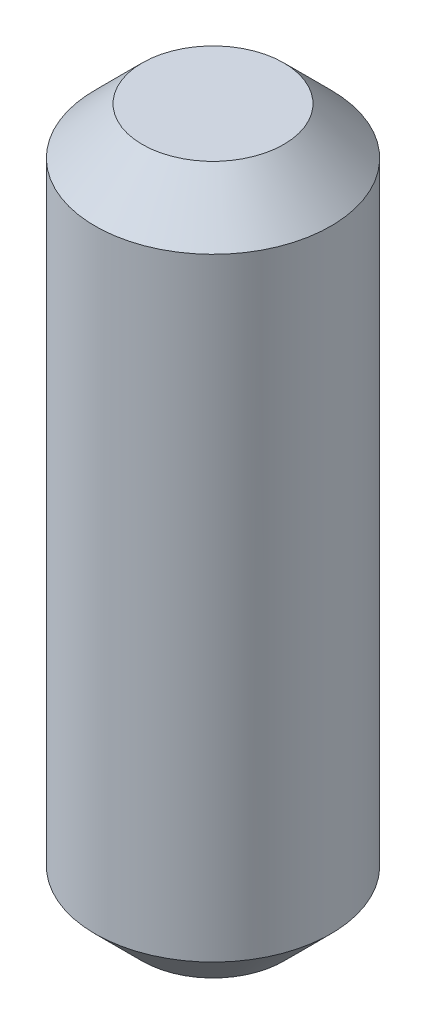
ISO-10303-21;
HEADER;
FILE_DESCRIPTION(('STEP AP214'),'2;1');
FILE_NAME('part.step','',(''),(''),'','','');
FILE_SCHEMA(('AUTOMOTIVE_DESIGN { 1 0 10303 214 1 1 1 1 }'));
ENDSEC;
DATA;
#1=APPLICATION_CONTEXT('core data for automotive mechanical design processes');
#2=APPLICATION_PROTOCOL_DEFINITION('international standard','automotive_design',2000,#1);
#3=PRODUCT_CONTEXT('',#1,'mechanical');
#4=PRODUCT('Part','Part','',(#3));
#5=PRODUCT_RELATED_PRODUCT_CATEGORY('part','',(#4));
#6=PRODUCT_DEFINITION_FORMATION('','',#4);
#7=PRODUCT_DEFINITION_CONTEXT('part definition',#1,'design');
#8=PRODUCT_DEFINITION('design','',#6,#7);
#9=PRODUCT_DEFINITION_SHAPE('','',#8);
#10=(LENGTH_UNIT() NAMED_UNIT(*) SI_UNIT(.MILLI.,.METRE.));
#11=(NAMED_UNIT(*) PLANE_ANGLE_UNIT() SI_UNIT($,.RADIAN.));
#12=(NAMED_UNIT(*) SI_UNIT($,.STERADIAN.) SOLID_ANGLE_UNIT());
#13=UNCERTAINTY_MEASURE_WITH_UNIT(LENGTH_MEASURE(1.E-05),#10,'distance_accuracy_value','');
#14=(GEOMETRIC_REPRESENTATION_CONTEXT(3) GLOBAL_UNCERTAINTY_ASSIGNED_CONTEXT((#13)) GLOBAL_UNIT_ASSIGNED_CONTEXT((#10,
#11,#12)) REPRESENTATION_CONTEXT('',''));
#15=CARTESIAN_POINT('',(0.,0.,0.));
#16=DIRECTION('',(0.,0.,1.));
#17=DIRECTION('',(1.,0.,0.));
#18=AXIS2_PLACEMENT_3D('',#15,#16,#17);
#19=CARTESIAN_POINT('',(0.,19.05,0.));
#20=DIRECTION('',(0.,-1.,0.));
#21=DIRECTION('',(0.,0.,-1.));
#22=AXIS2_PLACEMENT_3D('',#19,#20,#21);
#23=CYLINDRICAL_SURFACE('',#22,3.175);
#24=CARTESIAN_POINT('',(0.,1.27000000000001,0.));
#25=DIRECTION('',(0.,1.,0.));
#26=DIRECTION('',(0.,0.,1.));
#27=AXIS2_PLACEMENT_3D('',#24,#25,#26);
#28=CIRCLE('',#27,3.175);
#29=CARTESIAN_POINT('',(0.,1.27000000000001,-3.175));
#30=VERTEX_POINT('',#29);
#31=EDGE_CURVE('E48',#30,#30,#28,.T.);
#32=CARTESIAN_POINT('',(0.,17.78,0.));
#33=DIRECTION('',(0.,1.,0.));
#34=DIRECTION('',(0.,0.,1.));
#35=AXIS2_PLACEMENT_3D('',#32,#33,#34);
#36=CIRCLE('',#35,3.175);
#37=CARTESIAN_POINT('',(0.,17.78,-3.175));
#38=VERTEX_POINT('',#37);
#39=EDGE_CURVE('E55',#38,#38,#36,.F.);
#40=CARTESIAN_POINT('',(0.,1.27000000000001,-3.175));
#41=CARTESIAN_POINT('',(0.,1.44197916666668,-3.175));
#42=CARTESIAN_POINT('',(0.,1.61395833333335,-3.175));
#43=CARTESIAN_POINT('',(0.,1.95791666666668,-3.175));
#44=CARTESIAN_POINT('',(0.,2.12989583333335,-3.175));
#45=CARTESIAN_POINT('',(0.,2.47385416666668,-3.175));
#46=CARTESIAN_POINT('',(0.,2.64583333333335,-3.175));
#47=CARTESIAN_POINT('',(0.,2.98979166666668,-3.175));
#48=CARTESIAN_POINT('',(0.,3.16177083333335,-3.175));
#49=CARTESIAN_POINT('',(0.,3.50572916666668,-3.175));
#50=CARTESIAN_POINT('',(0.,3.67770833333335,-3.175));
#51=CARTESIAN_POINT('',(0.,4.02166666666668,-3.175));
#52=CARTESIAN_POINT('',(0.,4.19364583333335,-3.175));
#53=CARTESIAN_POINT('',(0.,4.53760416666668,-3.175));
#54=CARTESIAN_POINT('',(0.,4.70958333333335,-3.175));
#55=CARTESIAN_POINT('',(0.,5.05354166666668,-3.175));
#56=CARTESIAN_POINT('',(0.,5.22552083333335,-3.175));
#57=CARTESIAN_POINT('',(0.,5.56947916666668,-3.175));
#58=CARTESIAN_POINT('',(0.,5.74145833333335,-3.175));
#59=CARTESIAN_POINT('',(0.,6.08541666666668,-3.175));
#60=CARTESIAN_POINT('',(0.,6.25739583333335,-3.175));
#61=CARTESIAN_POINT('',(0.,6.60135416666668,-3.175));
#62=CARTESIAN_POINT('',(0.,6.77333333333335,-3.175));
#63=CARTESIAN_POINT('',(0.,7.11729166666668,-3.175));
#64=CARTESIAN_POINT('',(0.,7.28927083333335,-3.175));
#65=CARTESIAN_POINT('',(0.,7.63322916666668,-3.175));
#66=CARTESIAN_POINT('',(0.,7.80520833333335,-3.175));
#67=CARTESIAN_POINT('',(0.,8.14916666666668,-3.175));
#68=CARTESIAN_POINT('',(0.,8.32114583333335,-3.175));
#69=CARTESIAN_POINT('',(0.,8.66510416666668,-3.175));
#70=CARTESIAN_POINT('',(0.,8.83708333333335,-3.175));
#71=CARTESIAN_POINT('',(0.,9.18104166666668,-3.175));
#72=CARTESIAN_POINT('',(0.,9.35302083333335,-3.175));
#73=CARTESIAN_POINT('',(0.,9.69697916666668,-3.175));
#74=CARTESIAN_POINT('',(0.,9.86895833333335,-3.175));
#75=CARTESIAN_POINT('',(0.,10.2129166666667,-3.175));
#76=CARTESIAN_POINT('',(0.,10.3848958333334,-3.175));
#77=CARTESIAN_POINT('',(0.,10.7288541666667,-3.175));
#78=CARTESIAN_POINT('',(0.,10.9008333333334,-3.175));
#79=CARTESIAN_POINT('',(0.,11.2447916666667,-3.175));
#80=CARTESIAN_POINT('',(0.,11.4167708333334,-3.175));
#81=CARTESIAN_POINT('',(0.,11.7607291666667,-3.175));
#82=CARTESIAN_POINT('',(0.,11.9327083333334,-3.175));
#83=CARTESIAN_POINT('',(0.,12.2766666666667,-3.175));
#84=CARTESIAN_POINT('',(0.,12.4486458333334,-3.175));
#85=CARTESIAN_POINT('',(0.,12.7926041666667,-3.175));
#86=CARTESIAN_POINT('',(0.,12.9645833333334,-3.175));
#87=CARTESIAN_POINT('',(0.,13.3085416666667,-3.175));
#88=CARTESIAN_POINT('',(0.,13.4805208333334,-3.175));
#89=CARTESIAN_POINT('',(0.,13.8244791666667,-3.175));
#90=CARTESIAN_POINT('',(0.,13.9964583333334,-3.175));
#91=CARTESIAN_POINT('',(0.,14.3404166666667,-3.175));
#92=CARTESIAN_POINT('',(0.,14.5123958333334,-3.175));
#93=CARTESIAN_POINT('',(0.,14.8563541666667,-3.175));
#94=CARTESIAN_POINT('',(0.,15.0283333333334,-3.175));
#95=CARTESIAN_POINT('',(0.,15.3722916666667,-3.175));
#96=CARTESIAN_POINT('',(0.,15.5442708333334,-3.175));
#97=CARTESIAN_POINT('',(0.,15.8882291666667,-3.175));
#98=CARTESIAN_POINT('',(0.,16.0602083333334,-3.175));
#99=CARTESIAN_POINT('',(0.,16.4041666666667,-3.175));
#100=CARTESIAN_POINT('',(0.,16.5761458333334,-3.175));
#101=CARTESIAN_POINT('',(0.,16.9201041666667,-3.175));
#102=CARTESIAN_POINT('',(0.,17.0920833333334,-3.175));
#103=CARTESIAN_POINT('',(0.,17.4360416666667,-3.175));
#104=CARTESIAN_POINT('',(0.,17.6080208333334,-3.175));
#105=CARTESIAN_POINT('',(0.,17.78,-3.175));
#106=B_SPLINE_CURVE_WITH_KNOTS('',3,(#40,#41,#42,#43,#44,#45,#46,#47,#48,#49,#50,#51,#52,#53,
#54,#55,#56,#57,#58,#59,#60,#61,#62,#63,#64,#65,#66,#67,#68,#69,#70,#71,#72,#73,#74,#75,#76,#77,
#78,#79,#80,#81,#82,#83,#84,#85,#86,#87,#88,#89,#90,#91,#92,#93,#94,#95,#96,#97,#98,#99,#100,
#101,#102,#103,#104,#105),.UNSPECIFIED.,.F.,.F.,(4,2,2,2,2,2,2,2,2,2,2,2,2,2,2,2,2,2,2,2,2,2,2,
2,2,2,2,2,2,2,2,2,4),(0.,0.515937500000001,1.031875,1.5478125,2.06375,2.5796875,3.095625,
3.6115625,4.1275,4.6434375,5.159375,5.6753125,6.19125,6.7071875,7.223125,7.7390625,8.255,
8.7709375,9.28687500000001,9.8028125,10.31875,10.8346875,11.350625,11.8665625,12.3825,
12.8984375,13.414375,13.9303125,14.44625,14.9621875,15.478125,15.9940625,16.51),.UNSPECIFIED.);
#107=EDGE_CURVE('BSEAM32',#30,#38,#106,.T.);
#108=ORIENTED_EDGE('',*,*,#31,.T.);
#109=ORIENTED_EDGE('',*,*,#39,.T.);
#110=ORIENTED_EDGE('',*,*,#107,.T.);
#111=ORIENTED_EDGE('',*,*,#107,.F.);
#112=EDGE_LOOP('',(#108,#110,#109,#111));
#113=FACE_BOUND('',#112,.T.);
#114=ADVANCED_FACE('F32',(#113),#23,.T.);
#115=CARTESIAN_POINT('',(0.,19.05,0.));
#116=DIRECTION('',(0.,1.,0.));
#117=DIRECTION('',(0.,0.,1.));
#118=AXIS2_PLACEMENT_3D('',#115,#116,#117);
#119=PLANE('',#118);
#120=CARTESIAN_POINT('',(0.,19.05,0.));
#121=DIRECTION('',(0.,1.,0.));
#122=DIRECTION('',(0.,0.,1.));
#123=AXIS2_PLACEMENT_3D('',#120,#121,#122);
#124=CIRCLE('',#123,1.90500000000002);
#125=CARTESIAN_POINT('',(0.,19.05,1.90500000000002));
#126=VERTEX_POINT('',#125);
#127=EDGE_CURVE('E10',#126,#126,#124,.T.);
#128=ORIENTED_EDGE('',*,*,#127,.T.);
#129=EDGE_LOOP('',(#128));
#130=FACE_BOUND('',#129,.T.);
#131=ADVANCED_FACE('F73',(#130),#119,.T.);
#132=CARTESIAN_POINT('',(0.,0.,0.));
#133=DIRECTION('',(0.,1.,0.));
#134=DIRECTION('',(0.,0.,1.));
#135=AXIS2_PLACEMENT_3D('',#132,#133,#134);
#136=PLANE('',#135);
#137=CARTESIAN_POINT('',(0.,0.,0.));
#138=DIRECTION('',(0.,1.,0.));
#139=DIRECTION('',(0.,0.,1.));
#140=AXIS2_PLACEMENT_3D('',#137,#138,#139);
#141=CIRCLE('',#140,1.90499999999998);
#142=CARTESIAN_POINT('',(0.,0.,1.90499999999998));
#143=VERTEX_POINT('',#142);
#144=EDGE_CURVE('E40',#143,#143,#141,.F.);
#145=ORIENTED_EDGE('',*,*,#144,.T.);
#146=EDGE_LOOP('',(#145));
#147=FACE_BOUND('',#146,.T.);
#148=ADVANCED_FACE('F70',(#147),#136,.F.);
#149=CARTESIAN_POINT('',(0.,1.27000000000001,0.));
#150=DIRECTION('',(0.,1.,0.));
#151=DIRECTION('',(0.,0.,1.));
#152=AXIS2_PLACEMENT_3D('',#149,#150,#151);
#153=CONICAL_SURFACE('',#152,3.175,0.785398163397451);
#154=ORIENTED_EDGE('',*,*,#144,.F.);
#155=EDGE_LOOP('',(#154));
#156=FACE_BOUND('',#155,.T.);
#157=ORIENTED_EDGE('',*,*,#31,.F.);
#158=EDGE_LOOP('',(#157));
#159=FACE_BOUND('',#158,.T.);
#160=ADVANCED_FACE('F66',(#156,#159),#153,.T.);
#161=CARTESIAN_POINT('',(0.,19.05,0.));
#162=DIRECTION('',(0.,-1.,0.));
#163=DIRECTION('',(0.,0.,-1.));
#164=AXIS2_PLACEMENT_3D('',#161,#162,#163);
#165=CONICAL_SURFACE('',#164,1.90500000000002,0.785398163397448);
#166=ORIENTED_EDGE('',*,*,#39,.F.);
#167=EDGE_LOOP('',(#166));
#168=FACE_BOUND('',#167,.T.);
#169=ORIENTED_EDGE('',*,*,#127,.F.);
#170=EDGE_LOOP('',(#169));
#171=FACE_BOUND('',#170,.T.);
#172=ADVANCED_FACE('F34',(#168,#171),#165,.T.);
#173=CLOSED_SHELL('',(#114,#131,#148,#160,#172));
#174=MANIFOLD_SOLID_BREP('B2',#173);
#175=ADVANCED_BREP_SHAPE_REPRESENTATION('',(#18,#174),#14);
#176=SHAPE_DEFINITION_REPRESENTATION(#9,#175);
ENDSEC;
END-ISO-10303-21;
